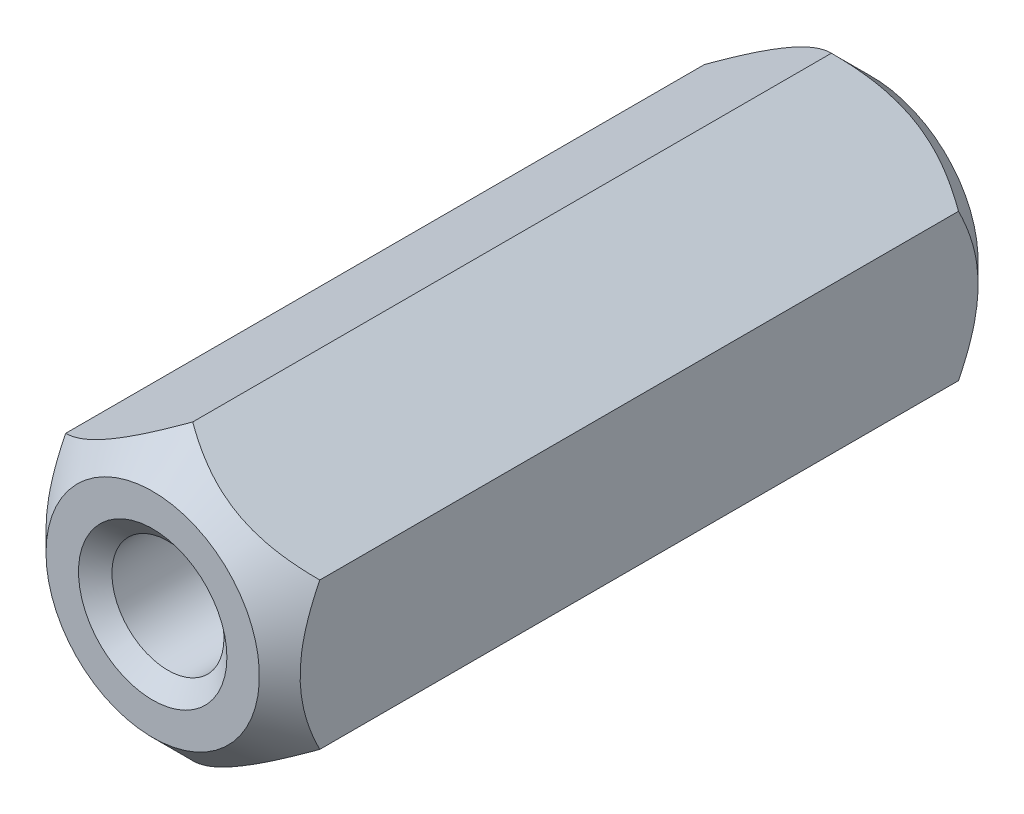
ISO-10303-21;
HEADER;
FILE_DESCRIPTION(('STEP AP214'),'2;1');
FILE_NAME('part.step','',(''),(''),'','','');
FILE_SCHEMA(('AUTOMOTIVE_DESIGN { 1 0 10303 214 1 1 1 1 }'));
ENDSEC;
DATA;
#1=APPLICATION_CONTEXT('core data for automotive mechanical design processes');
#2=APPLICATION_PROTOCOL_DEFINITION('international standard','automotive_design',2000,#1);
#3=PRODUCT_CONTEXT('',#1,'mechanical');
#4=PRODUCT('Part','Part','',(#3));
#5=PRODUCT_RELATED_PRODUCT_CATEGORY('part','',(#4));
#6=PRODUCT_DEFINITION_FORMATION('','',#4);
#7=PRODUCT_DEFINITION_CONTEXT('part definition',#1,'design');
#8=PRODUCT_DEFINITION('design','',#6,#7);
#9=PRODUCT_DEFINITION_SHAPE('','',#8);
#10=(LENGTH_UNIT() NAMED_UNIT(*) SI_UNIT(.MILLI.,.METRE.));
#11=(NAMED_UNIT(*) PLANE_ANGLE_UNIT() SI_UNIT($,.RADIAN.));
#12=(NAMED_UNIT(*) SI_UNIT($,.STERADIAN.) SOLID_ANGLE_UNIT());
#13=UNCERTAINTY_MEASURE_WITH_UNIT(LENGTH_MEASURE(1.E-05),#10,'distance_accuracy_value','');
#14=(GEOMETRIC_REPRESENTATION_CONTEXT(3) GLOBAL_UNCERTAINTY_ASSIGNED_CONTEXT((#13)) GLOBAL_UNIT_ASSIGNED_CONTEXT((#10,
#11,#12)) REPRESENTATION_CONTEXT('',''));
#15=CARTESIAN_POINT('',(0.,0.,0.));
#16=DIRECTION('',(0.,0.,1.));
#17=DIRECTION('',(1.,0.,0.));
#18=AXIS2_PLACEMENT_3D('',#15,#16,#17);
#19=CARTESIAN_POINT('',(0.,-3.66617420935412,-8.98));
#20=DIRECTION('',(0.5,-0.866025403784439,0.));
#21=DIRECTION('',(0.866025403784439,0.5,0.));
#22=AXIS2_PLACEMENT_3D('',#19,#20,#21);
#23=PLANE('',#22);
#24=CARTESIAN_POINT('',(3.1752,-1.83297163462322,-7.97988452449106));
#25=CARTESIAN_POINT('',(3.06606165005017,-1.89598269034567,-8.04284101630822));
#26=CARTESIAN_POINT('',(2.95509837192205,-1.9600473688431,-8.10209989576525));
#27=CARTESIAN_POINT('',(2.72883215365405,-2.09068223086865,-8.21060134426944));
#28=CARTESIAN_POINT('',(2.61350769674773,-2.15726483710766,-8.25978354606129));
#29=CARTESIAN_POINT('',(2.38096147751937,-2.29152545937819,-8.344033541126));
#30=CARTESIAN_POINT('',(2.26379893371884,-2.35916928558036,-8.37931308550055));
#31=CARTESIAN_POINT('',(2.02689455535371,-2.49594609220167,-8.43366842986518));
#32=CARTESIAN_POINT('',(1.90715995735644,-2.56507489458671,-8.45278480247036));
#33=CARTESIAN_POINT('',(1.70080208124841,-2.68421566990708,-8.47003286937675));
#34=CARTESIAN_POINT('',(1.61444529227084,-2.73407378526963,-8.47258606638617));
#35=CARTESIAN_POINT('',(1.44187218347527,-2.83370891608764,-8.46828372687673));
#36=CARTESIAN_POINT('',(1.35565592350718,-2.88348589698874,-8.46142489197855));
#37=CARTESIAN_POINT('',(1.18404020841286,-2.98256827629562,-8.43869011669629));
#38=CARTESIAN_POINT('',(1.09864177574671,-3.03187308438379,-8.42280409031272));
#39=CARTESIAN_POINT('',(0.92931159669451,-3.12963590884151,-8.38288201600204));
#40=CARTESIAN_POINT('',(0.845379738380235,-3.17809398983284,-8.35884659291482));
#41=CARTESIAN_POINT('',(0.696376420715868,-3.26412109539651,-8.30939476558283));
#42=CARTESIAN_POINT('',(0.630975148808253,-3.30188053733772,-8.28527828069901));
#43=CARTESIAN_POINT('',(0.501346749794881,-3.37672152840271,-8.23315853286284));
#44=CARTESIAN_POINT('',(0.437119658558265,-3.41380305681743,-8.20515515139647));
#45=CARTESIAN_POINT('',(0.310041965487392,-3.4871713971199,-8.14588943445549));
#46=CARTESIAN_POINT('',(0.247187749251269,-3.52346029578353,-8.11463734664579));
#47=CARTESIAN_POINT('',(0.122643379151903,-3.59536602138645,-8.04928465560807));
#48=CARTESIAN_POINT('',(0.0609525390212874,-3.63098324454239,-8.01518580048145));
#49=CARTESIAN_POINT('',(-0.000200000000001342,-3.66628967940796,-7.97988452449106));
#50=B_SPLINE_CURVE_WITH_KNOTS('',3,(#24,#25,#26,#27,#28,#29,#30,#31,#32,#33,#34,#35,#36,#37,#38,
#39,#40,#41,#42,#43,#44,#45,#46,#47,#48,#49),.UNSPECIFIED.,.F.,.F.,(4,2,2,2,2,2,2,2,2,2,2,2,4),
(0.,0.422910572436811,0.848285055427812,1.26690402276128,1.68446903107507,1.98329272958353,
2.28222117546892,2.58148426995467,2.88072442418454,3.11844134429547,3.35616551414406,
3.59316134346767,3.8300126974443),.UNSPECIFIED.);
#51=CARTESIAN_POINT('',(3.175,-1.83308710467706,-7.98));
#52=VERTEX_POINT('',#51);
#53=CARTESIAN_POINT('',(0.,-3.66617420935412,-7.98));
#54=VERTEX_POINT('',#53);
#55=EDGE_CURVE('E214',#52,#54,#50,.T.);
#56=ORIENTED_EDGE('',*,*,#55,.F.);
#57=DIRECTION('',(0.,0.,1.));
#58=VECTOR('',#57,1.);
#59=CARTESIAN_POINT('',(3.175,-1.83308710467706,-8.98));
#60=LINE('',#59,#58);
#61=CARTESIAN_POINT('',(3.175,-1.83308710467706,7.98));
#62=VERTEX_POINT('',#61);
#63=EDGE_CURVE('E43',#52,#62,#60,.T.);
#64=ORIENTED_EDGE('',*,*,#63,.T.);
#65=CARTESIAN_POINT('',(-0.000200000000000843,-3.66628967940796,7.97988452449106));
#66=CARTESIAN_POINT('',(0.108938349949826,-3.60327862368552,8.04284101630822));
#67=CARTESIAN_POINT('',(0.219901628077945,-3.53921394518808,8.10209989576525));
#68=CARTESIAN_POINT('',(0.446167846345948,-3.40857908316254,8.21060134426944));
#69=CARTESIAN_POINT('',(0.561492303252264,-3.34199647692353,8.25978354606129));
#70=CARTESIAN_POINT('',(0.794038522480628,-3.207735854653,8.344033541126));
#71=CARTESIAN_POINT('',(0.911201066281153,-3.14009202845083,8.37931308550055));
#72=CARTESIAN_POINT('',(1.14810544464628,-3.00331522182952,8.43366842986518));
#73=CARTESIAN_POINT('',(1.26784004264356,-2.93418641944448,8.45278480247036));
#74=CARTESIAN_POINT('',(1.47419791875159,-2.81504564412411,8.47003286937675));
#75=CARTESIAN_POINT('',(1.56055470772916,-2.76518752876156,8.47258606638617));
#76=CARTESIAN_POINT('',(1.73312781652472,-2.66555239794355,8.46828372687673));
#77=CARTESIAN_POINT('',(1.81934407649281,-2.61577541704245,8.46142489197855));
#78=CARTESIAN_POINT('',(1.99095979158714,-2.51669303773557,8.43869011669629));
#79=CARTESIAN_POINT('',(2.07635822425329,-2.4673882296474,8.42280409031272));
#80=CARTESIAN_POINT('',(2.24568840330549,-2.36962540518968,8.38288201600204));
#81=CARTESIAN_POINT('',(2.32962026161976,-2.32116732419835,8.35884659291482));
#82=CARTESIAN_POINT('',(2.47862357928413,-2.23514021863468,8.30939476558283));
#83=CARTESIAN_POINT('',(2.54402485119174,-2.19738077669347,8.285278280699));
#84=CARTESIAN_POINT('',(2.67365325020512,-2.12253978562848,8.23315853286284));
#85=CARTESIAN_POINT('',(2.73788034144173,-2.08545825721376,8.20515515139647));
#86=CARTESIAN_POINT('',(2.86495803451261,-2.01208991691129,8.14588943445549));
#87=CARTESIAN_POINT('',(2.92781225074873,-1.97580101824766,8.11463734664579));
#88=CARTESIAN_POINT('',(3.0523566208481,-1.90389529264474,8.04928465560806));
#89=CARTESIAN_POINT('',(3.11404746097871,-1.8682780694888,8.01518580048145));
#90=CARTESIAN_POINT('',(3.1752,-1.83297163462323,7.97988452449106));
#91=B_SPLINE_CURVE_WITH_KNOTS('',3,(#65,#66,#67,#68,#69,#70,#71,#72,#73,#74,#75,#76,#77,#78,#79,
#80,#81,#82,#83,#84,#85,#86,#87,#88,#89,#90),.UNSPECIFIED.,.F.,.F.,(4,2,2,2,2,2,2,2,2,2,2,2,4),
(0.,0.42291057243681,0.848285055427811,1.26690402276128,1.68446903107507,1.98329272958352,
2.28222117546891,2.58148426995467,2.88072442418453,3.11844134429547,3.35616551414406,
3.59316134346767,3.83001269744429),.UNSPECIFIED.);
#92=CARTESIAN_POINT('',(0.,-3.66617420935412,7.98));
#93=VERTEX_POINT('',#92);
#94=EDGE_CURVE('E131',#93,#62,#91,.T.);
#95=ORIENTED_EDGE('',*,*,#94,.F.);
#96=DIRECTION('',(0.,0.,1.));
#97=VECTOR('',#96,1.);
#98=CARTESIAN_POINT('',(0.,-3.66617420935412,-8.98));
#99=LINE('',#98,#97);
#100=EDGE_CURVE('E11',#54,#93,#99,.T.);
#101=ORIENTED_EDGE('',*,*,#100,.F.);
#102=EDGE_LOOP('',(#56,#64,#95,#101));
#103=FACE_BOUND('',#102,.T.);
#104=ADVANCED_FACE('F39',(#103),#23,.T.);
#105=CARTESIAN_POINT('',(-3.175,-1.83308710467706,-8.98));
#106=DIRECTION('',(-0.5,-0.866025403784438,0.));
#107=DIRECTION('',(0.866025403784439,-0.5,0.));
#108=AXIS2_PLACEMENT_3D('',#105,#106,#107);
#109=PLANE('',#108);
#110=CARTESIAN_POINT('',(0.000199999999999404,-3.66628967940796,-7.97988452449106));
#111=CARTESIAN_POINT('',(-0.108938349949828,-3.60327862368552,-8.04284101630822));
#112=CARTESIAN_POINT('',(-0.219901628077947,-3.53921394518808,-8.10209989576525));
#113=CARTESIAN_POINT('',(-0.44616784634595,-3.40857908316253,-8.21060134426944));
#114=CARTESIAN_POINT('',(-0.561492303252266,-3.34199647692352,-8.25978354606129));
#115=CARTESIAN_POINT('',(-0.79403852248063,-3.207735854653,-8.344033541126));
#116=CARTESIAN_POINT('',(-0.911201066281154,-3.14009202845082,-8.37931308550055));
#117=CARTESIAN_POINT('',(-1.14810544464629,-3.00331522182951,-8.43366842986518));
#118=CARTESIAN_POINT('',(-1.26784004264356,-2.93418641944448,-8.45278480247036));
#119=CARTESIAN_POINT('',(-1.47419791875159,-2.81504564412411,-8.47003286937675));
#120=CARTESIAN_POINT('',(-1.56055470772916,-2.76518752876155,-8.47258606638618));
#121=CARTESIAN_POINT('',(-1.73312781652473,-2.66555239794354,-8.46828372687673));
#122=CARTESIAN_POINT('',(-1.81934407649281,-2.61577541704245,-8.46142489197855));
#123=CARTESIAN_POINT('',(-1.99095979158714,-2.51669303773557,-8.43869011669629));
#124=CARTESIAN_POINT('',(-2.07635822425329,-2.46738822964739,-8.42280409031272));
#125=CARTESIAN_POINT('',(-2.24568840330549,-2.36962540518968,-8.38288201600204));
#126=CARTESIAN_POINT('',(-2.32962026161976,-2.32116732419835,-8.35884659291482));
#127=CARTESIAN_POINT('',(-2.47862357928413,-2.23514021863468,-8.30939476558283));
#128=CARTESIAN_POINT('',(-2.54402485119175,-2.19738077669347,-8.28527828069901));
#129=CARTESIAN_POINT('',(-2.67365325020512,-2.12253978562848,-8.23315853286284));
#130=CARTESIAN_POINT('',(-2.73788034144173,-2.08545825721375,-8.20515515139647));
#131=CARTESIAN_POINT('',(-2.86495803451261,-2.01208991691129,-8.14588943445549));
#132=CARTESIAN_POINT('',(-2.92781225074873,-1.97580101824766,-8.11463734664579));
#133=CARTESIAN_POINT('',(-3.0523566208481,-1.90389529264474,-8.04928465560807));
#134=CARTESIAN_POINT('',(-3.11404746097871,-1.86827806948879,-8.01518580048146));
#135=CARTESIAN_POINT('',(-3.1752,-1.83297163462322,-7.97988452449106));
#136=B_SPLINE_CURVE_WITH_KNOTS('',3,(#110,#111,#112,#113,#114,#115,#116,#117,#118,#119,#120,
#121,#122,#123,#124,#125,#126,#127,#128,#129,#130,#131,#132,#133,#134,#135),.UNSPECIFIED.,.F.,
.F.,(4,2,2,2,2,2,2,2,2,2,2,2,4),(0.,0.42291057243681,0.848285055427811,1.26690402276128,
1.68446903107507,1.98329272958353,2.28222117546891,2.58148426995467,2.88072442418453,
3.11844134429547,3.35616551414406,3.59316134346767,3.83001269744429),.UNSPECIFIED.);
#137=CARTESIAN_POINT('',(-3.175,-1.83308710467706,-7.98));
#138=VERTEX_POINT('',#137);
#139=EDGE_CURVE('E99',#54,#138,#136,.T.);
#140=ORIENTED_EDGE('',*,*,#139,.F.);
#141=ORIENTED_EDGE('',*,*,#100,.T.);
#142=CARTESIAN_POINT('',(-3.1752,-1.83297163462322,7.97988452449106));
#143=CARTESIAN_POINT('',(-3.06606165005017,-1.89598269034567,8.04284101630822));
#144=CARTESIAN_POINT('',(-2.95509837192205,-1.9600473688431,8.10209989576526));
#145=CARTESIAN_POINT('',(-2.72883215365405,-2.09068223086865,8.21060134426944));
#146=CARTESIAN_POINT('',(-2.61350769674774,-2.15726483710766,8.25978354606129));
#147=CARTESIAN_POINT('',(-2.38096147751937,-2.29152545937818,8.344033541126));
#148=CARTESIAN_POINT('',(-2.26379893371885,-2.35916928558036,8.37931308550055));
#149=CARTESIAN_POINT('',(-2.02689455535372,-2.49594609220167,8.43366842986518));
#150=CARTESIAN_POINT('',(-1.90715995735644,-2.56507489458671,8.45278480247036));
#151=CARTESIAN_POINT('',(-1.70080208124842,-2.68421566990707,8.47003286937675));
#152=CARTESIAN_POINT('',(-1.61444529227084,-2.73407378526963,8.47258606638618));
#153=CARTESIAN_POINT('',(-1.44187218347528,-2.83370891608764,8.46828372687673));
#154=CARTESIAN_POINT('',(-1.35565592350719,-2.88348589698874,8.46142489197855));
#155=CARTESIAN_POINT('',(-1.18404020841286,-2.98256827629562,8.43869011669629));
#156=CARTESIAN_POINT('',(-1.09864177574672,-3.03187308438379,8.42280409031272));
#157=CARTESIAN_POINT('',(-0.929311596694514,-3.1296359088415,8.38288201600204));
#158=CARTESIAN_POINT('',(-0.845379738380239,-3.17809398983284,8.35884659291482));
#159=CARTESIAN_POINT('',(-0.696376420715872,-3.26412109539651,8.30939476558283));
#160=CARTESIAN_POINT('',(-0.630975148808256,-3.30188053733771,8.28527828069901));
#161=CARTESIAN_POINT('',(-0.501346749794884,-3.3767215284027,8.23315853286284));
#162=CARTESIAN_POINT('',(-0.437119658558269,-3.41380305681743,8.20515515139647));
#163=CARTESIAN_POINT('',(-0.310041965487394,-3.4871713971199,8.14588943445549));
#164=CARTESIAN_POINT('',(-0.247187749251271,-3.52346029578352,8.11463734664579));
#165=CARTESIAN_POINT('',(-0.122643379151904,-3.59536602138645,8.04928465560807));
#166=CARTESIAN_POINT('',(-0.0609525390212889,-3.63098324454239,8.01518580048146));
#167=CARTESIAN_POINT('',(0.000199999999999563,-3.66628967940796,7.97988452449106));
#168=B_SPLINE_CURVE_WITH_KNOTS('',3,(#142,#143,#144,#145,#146,#147,#148,#149,#150,#151,#152,
#153,#154,#155,#156,#157,#158,#159,#160,#161,#162,#163,#164,#165,#166,#167),.UNSPECIFIED.,.F.,
.F.,(4,2,2,2,2,2,2,2,2,2,2,2,4),(0.,0.422910572436809,0.84828505542781,1.26690402276127,
1.68446903107507,1.98329272958352,2.28222117546891,2.58148426995467,2.88072442418453,
3.11844134429547,3.35616551414406,3.59316134346767,3.8300126974443),.UNSPECIFIED.);
#169=CARTESIAN_POINT('',(-3.175,-1.83308710467706,7.98));
#170=VERTEX_POINT('',#169);
#171=EDGE_CURVE('E133',#170,#93,#168,.T.);
#172=ORIENTED_EDGE('',*,*,#171,.F.);
#173=DIRECTION('',(0.,0.,1.));
#174=VECTOR('',#173,1.);
#175=CARTESIAN_POINT('',(-3.175,-1.83308710467706,-8.98));
#176=LINE('',#175,#174);
#177=EDGE_CURVE('E49',#138,#170,#176,.T.);
#178=ORIENTED_EDGE('',*,*,#177,.F.);
#179=EDGE_LOOP('',(#140,#141,#172,#178));
#180=FACE_BOUND('',#179,.T.);
#181=ADVANCED_FACE('F194',(#180),#109,.T.);
#182=CARTESIAN_POINT('',(-3.175,1.83308710467706,-8.98));
#183=DIRECTION('',(-1.,0.,0.));
#184=DIRECTION('',(0.,-1.,0.));
#185=AXIS2_PLACEMENT_3D('',#182,#183,#184);
#186=PLANE('',#185);
#187=CARTESIAN_POINT('',(-3.175,-3.62314366162436,-6.82872727215091));
#188=CARTESIAN_POINT('',(-3.175,-3.53477477471413,-6.89517330066197));
#189=CARTESIAN_POINT('',(-3.175,-3.44590747401783,-6.96096732929089));
#190=CARTESIAN_POINT('',(-3.175,-3.26698086109357,-7.09096065674581));
#191=CARTESIAN_POINT('',(-3.175,-3.17692125186334,-7.15515954631578));
#192=CARTESIAN_POINT('',(-3.175,-2.9947562299698,-7.28212801376402));
#193=CARTESIAN_POINT('',(-3.175,-2.90264037042889,-7.34488265440275));
#194=CARTESIAN_POINT('',(-3.175,-2.71683951537136,-7.4680168325571));
#195=CARTESIAN_POINT('',(-3.175,-2.62315463201829,-7.52839653882317));
#196=CARTESIAN_POINT('',(-3.175,-2.42867521304995,-7.64955311497214));
#197=CARTESIAN_POINT('',(-3.175,-2.327776197965,-7.71016312895682));
#198=CARTESIAN_POINT('',(-3.175,-2.1236266416231,-7.82734891241029));
#199=CARTESIAN_POINT('',(-3.175,-2.02037573570296,-7.88392405057173));
#200=CARTESIAN_POINT('',(-3.175,-1.81153946353305,-7.99181638181168));
#201=CARTESIAN_POINT('',(-3.175,-1.70596214797143,-8.04314903574252));
#202=CARTESIAN_POINT('',(-3.175,-1.49194968831593,-8.13940753599678));
#203=CARTESIAN_POINT('',(-3.175,-1.38351585328126,-8.18433625855787));
#204=CARTESIAN_POINT('',(-3.175,-1.17206906194383,-8.26305402653428));
#205=CARTESIAN_POINT('',(-3.175,-1.06927808219159,-8.2974331189904));
#206=CARTESIAN_POINT('',(-3.175,-0.861249989752693,-8.35794018821903));
#207=CARTESIAN_POINT('',(-3.175,-0.756012706347597,-8.38406758726936));
#208=CARTESIAN_POINT('',(-3.175,-0.545455116385145,-8.42628154980003));
#209=CARTESIAN_POINT('',(-3.175,-0.440169465308187,-8.44253816718228));
#210=CARTESIAN_POINT('',(-3.175,-0.228508692793317,-8.46470019179704));
#211=CARTESIAN_POINT('',(-3.175,-0.122133754622792,-8.47060731241113));
#212=CARTESIAN_POINT('',(-3.175,0.0869577968377128,-8.47164473816365));
#213=CARTESIAN_POINT('',(-3.175,0.189672720284836,-8.46714340706931));
#214=CARTESIAN_POINT('',(-3.175,0.394206632826208,-8.44841780352249));
#215=CARTESIAN_POINT('',(-3.175,0.496025532914313,-8.43419257595037));
#216=CARTESIAN_POINT('',(-3.175,0.699751411908734,-8.39654774602645));
#217=CARTESIAN_POINT('',(-3.175,0.801629229158968,-8.3729728022883));
#218=CARTESIAN_POINT('',(-3.175,1.00316901022372,-8.31787603830061));
#219=CARTESIAN_POINT('',(-3.175,1.10283116972946,-8.28635492293116));
#220=CARTESIAN_POINT('',(-3.175,1.30972972723242,-8.21313974500301));
#221=CARTESIAN_POINT('',(-3.175,1.41671377003006,-8.17073954984725));
#222=CARTESIAN_POINT('',(-3.175,1.62788222750015,-8.07944550923611));
#223=CARTESIAN_POINT('',(-3.175,1.73206568079256,-8.03054946728032));
#224=CARTESIAN_POINT('',(-3.175,1.93816752656033,-7.9274201972936));
#225=CARTESIAN_POINT('',(-3.175,2.04007726416977,-7.87316981162605));
#226=CARTESIAN_POINT('',(-3.175,2.24154914453307,-7.76053481703511));
#227=CARTESIAN_POINT('',(-3.175,2.34111165997837,-7.70215087041164));
#228=CARTESIAN_POINT('',(-3.175,2.53328789139578,-7.58505822864378));
#229=CARTESIAN_POINT('',(-3.175,2.62600050272272,-7.52651098750221));
#230=CARTESIAN_POINT('',(-3.175,2.80983442239984,-7.40696182904578));
#231=CARTESIAN_POINT('',(-3.175,2.90095560921207,-7.34595972541708));
#232=CARTESIAN_POINT('',(-3.175,3.08107470813498,-7.22244540123562));
#233=CARTESIAN_POINT('',(-3.175,3.17008386871529,-7.15994952545103));
#234=CARTESIAN_POINT('',(-3.175,3.34688695470737,-7.03331054967444));
#235=CARTESIAN_POINT('',(-3.175,3.43468120733686,-6.96916790704841));
#236=CARTESIAN_POINT('',(-3.175,3.52196693533842,-6.90435218679603));
#237=B_SPLINE_CURVE_WITH_KNOTS('',3,(#187,#188,#189,#190,#191,#192,#193,#194,#195,#196,#197,
#198,#199,#200,#201,#202,#203,#204,#205,#206,#207,#208,#209,#210,#211,#212,#213,#214,#215,#216,
#217,#218,#219,#220,#221,#222,#223,#224,#225,#226,#227,#228,#229,#230,#231,#232,#233,#234,#235,
#236),.UNSPECIFIED.,.F.,.F.,(4,2,2,2,2,2,2,2,2,2,2,2,2,2,2,2,2,2,2,2,2,2,2,2,4),(0.,
0.331695086033259,0.663474412411203,0.99782559347852,1.33215297421855,1.68518935827853,
2.03828085871132,2.39029899374214,2.74215852308448,3.06703502033416,3.39193425797894,
3.71106436530982,4.03014163496714,4.33810010599997,4.64608883028138,4.95942473763719,
5.27273285971666,5.61770254927929,5.96278918493365,6.30901993384334,6.65519533292016,
6.9841037594293,7.3130371959719,7.63929174244194,7.96545663622252),.UNSPECIFIED.);
#238=CARTESIAN_POINT('',(-3.175,1.83308710467706,-7.98));
#239=VERTEX_POINT('',#238);
#240=EDGE_CURVE('E93',#138,#239,#237,.T.);
#241=ORIENTED_EDGE('',*,*,#240,.F.);
#242=ORIENTED_EDGE('',*,*,#177,.T.);
#243=CARTESIAN_POINT('',(-3.175,-3.62314366162436,6.82872727215091));
#244=CARTESIAN_POINT('',(-3.175,-3.53477477471413,6.89517330066197));
#245=CARTESIAN_POINT('',(-3.175,-3.44590747401783,6.96096732929089));
#246=CARTESIAN_POINT('',(-3.175,-3.26698086109357,7.09096065674581));
#247=CARTESIAN_POINT('',(-3.175,-3.17692125186334,7.15515954631578));
#248=CARTESIAN_POINT('',(-3.175,-2.9947562299698,7.28212801376402));
#249=CARTESIAN_POINT('',(-3.175,-2.90264037042889,7.34488265440275));
#250=CARTESIAN_POINT('',(-3.175,-2.71683951537136,7.4680168325571));
#251=CARTESIAN_POINT('',(-3.175,-2.62315463201829,7.52839653882317));
#252=CARTESIAN_POINT('',(-3.175,-2.42867521304995,7.64955311497214));
#253=CARTESIAN_POINT('',(-3.175,-2.327776197965,7.71016312895682));
#254=CARTESIAN_POINT('',(-3.175,-2.1236266416231,7.82734891241029));
#255=CARTESIAN_POINT('',(-3.175,-2.02037573570296,7.88392405057173));
#256=CARTESIAN_POINT('',(-3.175,-1.81153946353305,7.99181638181168));
#257=CARTESIAN_POINT('',(-3.175,-1.70596214797143,8.04314903574252));
#258=CARTESIAN_POINT('',(-3.175,-1.49194968831593,8.13940753599678));
#259=CARTESIAN_POINT('',(-3.175,-1.38351585328126,8.18433625855787));
#260=CARTESIAN_POINT('',(-3.175,-1.17206906194383,8.26305402653428));
#261=CARTESIAN_POINT('',(-3.175,-1.06927808219159,8.2974331189904));
#262=CARTESIAN_POINT('',(-3.175,-0.861249989752693,8.35794018821903));
#263=CARTESIAN_POINT('',(-3.175,-0.756012706347597,8.38406758726936));
#264=CARTESIAN_POINT('',(-3.175,-0.545455116385145,8.42628154980003));
#265=CARTESIAN_POINT('',(-3.175,-0.440169465308187,8.44253816718228));
#266=CARTESIAN_POINT('',(-3.175,-0.228508692793317,8.46470019179704));
#267=CARTESIAN_POINT('',(-3.175,-0.122133754622792,8.47060731241113));
#268=CARTESIAN_POINT('',(-3.175,0.0869577968377128,8.47164473816365));
#269=CARTESIAN_POINT('',(-3.175,0.189672720284836,8.46714340706931));
#270=CARTESIAN_POINT('',(-3.175,0.394206632826208,8.44841780352249));
#271=CARTESIAN_POINT('',(-3.175,0.496025532914313,8.43419257595037));
#272=CARTESIAN_POINT('',(-3.175,0.699751411908734,8.39654774602645));
#273=CARTESIAN_POINT('',(-3.175,0.801629229158968,8.3729728022883));
#274=CARTESIAN_POINT('',(-3.175,1.00316901022372,8.31787603830061));
#275=CARTESIAN_POINT('',(-3.175,1.10283116972946,8.28635492293116));
#276=CARTESIAN_POINT('',(-3.175,1.30972972723242,8.21313974500301));
#277=CARTESIAN_POINT('',(-3.175,1.41671377003006,8.17073954984725));
#278=CARTESIAN_POINT('',(-3.175,1.62788222750015,8.07944550923611));
#279=CARTESIAN_POINT('',(-3.175,1.73206568079256,8.03054946728032));
#280=CARTESIAN_POINT('',(-3.175,1.93816752656033,7.9274201972936));
#281=CARTESIAN_POINT('',(-3.175,2.04007726416977,7.87316981162605));
#282=CARTESIAN_POINT('',(-3.175,2.24154914453307,7.76053481703511));
#283=CARTESIAN_POINT('',(-3.175,2.34111165997837,7.70215087041164));
#284=CARTESIAN_POINT('',(-3.175,2.53328789139578,7.58505822864378));
#285=CARTESIAN_POINT('',(-3.175,2.62600050272272,7.52651098750221));
#286=CARTESIAN_POINT('',(-3.175,2.80983442239984,7.40696182904578));
#287=CARTESIAN_POINT('',(-3.175,2.90095560921207,7.34595972541708));
#288=CARTESIAN_POINT('',(-3.175,3.08107470813498,7.22244540123562));
#289=CARTESIAN_POINT('',(-3.175,3.17008386871529,7.15994952545103));
#290=CARTESIAN_POINT('',(-3.175,3.34688695470737,7.03331054967444));
#291=CARTESIAN_POINT('',(-3.175,3.43468120733686,6.96916790704841));
#292=CARTESIAN_POINT('',(-3.175,3.52196693533842,6.90435218679603));
#293=B_SPLINE_CURVE_WITH_KNOTS('',3,(#243,#244,#245,#246,#247,#248,#249,#250,#251,#252,#253,
#254,#255,#256,#257,#258,#259,#260,#261,#262,#263,#264,#265,#266,#267,#268,#269,#270,#271,#272,
#273,#274,#275,#276,#277,#278,#279,#280,#281,#282,#283,#284,#285,#286,#287,#288,#289,#290,#291,
#292),.UNSPECIFIED.,.F.,.F.,(4,2,2,2,2,2,2,2,2,2,2,2,2,2,2,2,2,2,2,2,2,2,2,2,4),(0.,
0.331695086033259,0.663474412411203,0.99782559347852,1.33215297421855,1.68518935827853,
2.03828085871132,2.39029899374214,2.74215852308448,3.06703502033416,3.39193425797894,
3.71106436530982,4.03014163496714,4.33810010599997,4.64608883028138,4.95942473763719,
5.27273285971666,5.61770254927929,5.96278918493365,6.30901993384334,6.65519533292016,
6.9841037594293,7.3130371959719,7.63929174244194,7.96545663622252),.UNSPECIFIED.);
#294=CARTESIAN_POINT('',(-3.175,1.83308710467706,7.98));
#295=VERTEX_POINT('',#294);
#296=EDGE_CURVE('E117',#295,#170,#293,.F.);
#297=ORIENTED_EDGE('',*,*,#296,.F.);
#298=DIRECTION('',(0.,0.,1.));
#299=VECTOR('',#298,1.);
#300=CARTESIAN_POINT('',(-3.175,1.83308710467706,-8.98));
#301=LINE('',#300,#299);
#302=EDGE_CURVE('E109',#239,#295,#301,.T.);
#303=ORIENTED_EDGE('',*,*,#302,.F.);
#304=EDGE_LOOP('',(#241,#242,#297,#303));
#305=FACE_BOUND('',#304,.T.);
#306=ADVANCED_FACE('F115',(#305),#186,.T.);
#307=CARTESIAN_POINT('',(0.,3.66617420935412,-8.98));
#308=DIRECTION('',(-0.5,0.866025403784439,0.));
#309=DIRECTION('',(-0.866025403784439,-0.5,0.));
#310=AXIS2_PLACEMENT_3D('',#307,#308,#309);
#311=PLANE('',#310);
#312=CARTESIAN_POINT('',(-3.1752,1.83297163462323,-7.97988452449106));
#313=CARTESIAN_POINT('',(-3.06606165005017,1.89598269034567,-8.04284101630822));
#314=CARTESIAN_POINT('',(-2.95509837192205,1.9600473688431,-8.10209989576525));
#315=CARTESIAN_POINT('',(-2.72883215365405,2.09068223086865,-8.21060134426944));
#316=CARTESIAN_POINT('',(-2.61350769674773,2.15726483710766,-8.25978354606129));
#317=CARTESIAN_POINT('',(-2.38096147751937,2.29152545937819,-8.344033541126));
#318=CARTESIAN_POINT('',(-2.26379893371885,2.35916928558036,-8.37931308550055));
#319=CARTESIAN_POINT('',(-2.02689455535371,2.49594609220167,-8.43366842986518));
#320=CARTESIAN_POINT('',(-1.90715995735644,2.56507489458671,-8.45278480247036));
#321=CARTESIAN_POINT('',(-1.70080208124841,2.68421566990708,-8.47003286937675));
#322=CARTESIAN_POINT('',(-1.61444529227084,2.73407378526963,-8.47258606638618));
#323=CARTESIAN_POINT('',(-1.44187218347527,2.83370891608764,-8.46828372687673));
#324=CARTESIAN_POINT('',(-1.35565592350719,2.88348589698874,-8.46142489197855));
#325=CARTESIAN_POINT('',(-1.18404020841286,2.98256827629562,-8.43869011669629));
#326=CARTESIAN_POINT('',(-1.09864177574671,3.03187308438379,-8.42280409031272));
#327=CARTESIAN_POINT('',(-0.929311596694511,3.12963590884151,-8.38288201600204));
#328=CARTESIAN_POINT('',(-0.845379738380236,3.17809398983284,-8.35884659291482));
#329=CARTESIAN_POINT('',(-0.696376420715869,3.26412109539651,-8.30939476558283));
#330=CARTESIAN_POINT('',(-0.630975148808253,3.30188053733771,-8.28527828069901));
#331=CARTESIAN_POINT('',(-0.501346749794881,3.37672152840271,-8.23315853286284));
#332=CARTESIAN_POINT('',(-0.437119658558266,3.41380305681743,-8.20515515139647));
#333=CARTESIAN_POINT('',(-0.310041965487392,3.4871713971199,-8.14588943445549));
#334=CARTESIAN_POINT('',(-0.247187749251269,3.52346029578353,-8.11463734664579));
#335=CARTESIAN_POINT('',(-0.122643379151903,3.59536602138645,-8.04928465560806));
#336=CARTESIAN_POINT('',(-0.0609525390212874,3.63098324454239,-8.01518580048145));
#337=CARTESIAN_POINT('',(0.000200000000001656,3.66628967940796,-7.97988452449106));
#338=B_SPLINE_CURVE_WITH_KNOTS('',3,(#312,#313,#314,#315,#316,#317,#318,#319,#320,#321,#322,
#323,#324,#325,#326,#327,#328,#329,#330,#331,#332,#333,#334,#335,#336,#337),.UNSPECIFIED.,.F.,
.F.,(4,2,2,2,2,2,2,2,2,2,2,2,4),(0.,0.42291057243681,0.84828505542781,1.26690402276128,
1.68446903107507,1.98329272958352,2.28222117546891,2.58148426995467,2.88072442418453,
3.11844134429547,3.35616551414406,3.59316134346767,3.8300126974443),.UNSPECIFIED.);
#339=CARTESIAN_POINT('',(0.,3.66617420935412,-7.98));
#340=VERTEX_POINT('',#339);
#341=EDGE_CURVE('E97',#239,#340,#338,.T.);
#342=ORIENTED_EDGE('',*,*,#341,.F.);
#343=ORIENTED_EDGE('',*,*,#302,.T.);
#344=CARTESIAN_POINT('',(0.000200000000001738,3.66628967940796,7.97988452449106));
#345=CARTESIAN_POINT('',(-0.108938349949825,3.60327862368552,8.04284101630822));
#346=CARTESIAN_POINT('',(-0.219901628077945,3.53921394518808,8.10209989576525));
#347=CARTESIAN_POINT('',(-0.446167846345948,3.40857908316253,8.21060134426944));
#348=CARTESIAN_POINT('',(-0.561492303252265,3.34199647692353,8.25978354606129));
#349=CARTESIAN_POINT('',(-0.79403852248063,3.207735854653,8.344033541126));
#350=CARTESIAN_POINT('',(-0.911201066281154,3.14009202845082,8.37931308550055));
#351=CARTESIAN_POINT('',(-1.14810544464629,3.00331522182951,8.43366842986518));
#352=CARTESIAN_POINT('',(-1.26784004264356,2.93418641944448,8.45278480247036));
#353=CARTESIAN_POINT('',(-1.47419791875159,2.81504564412411,8.47003286937675));
#354=CARTESIAN_POINT('',(-1.56055470772916,2.76518752876155,8.47258606638618));
#355=CARTESIAN_POINT('',(-1.73312781652473,2.66555239794354,8.46828372687673));
#356=CARTESIAN_POINT('',(-1.81934407649282,2.61577541704245,8.46142489197855));
#357=CARTESIAN_POINT('',(-1.99095979158714,2.51669303773557,8.43869011669629));
#358=CARTESIAN_POINT('',(-2.07635822425329,2.4673882296474,8.42280409031272));
#359=CARTESIAN_POINT('',(-2.24568840330549,2.36962540518968,8.38288201600204));
#360=CARTESIAN_POINT('',(-2.32962026161977,2.32116732419835,8.35884659291482));
#361=CARTESIAN_POINT('',(-2.47862357928413,2.23514021863468,8.30939476558283));
#362=CARTESIAN_POINT('',(-2.54402485119175,2.19738077669347,8.28527828069901));
#363=CARTESIAN_POINT('',(-2.67365325020512,2.12253978562848,8.23315853286284));
#364=CARTESIAN_POINT('',(-2.73788034144173,2.08545825721376,8.20515515139647));
#365=CARTESIAN_POINT('',(-2.86495803451261,2.01208991691129,8.14588943445548));
#366=CARTESIAN_POINT('',(-2.92781225074873,1.97580101824766,8.11463734664579));
#367=CARTESIAN_POINT('',(-3.0523566208481,1.90389529264474,8.04928465560807));
#368=CARTESIAN_POINT('',(-3.11404746097871,1.8682780694888,8.01518580048145));
#369=CARTESIAN_POINT('',(-3.1752,1.83297163462323,7.97988452449106));
#370=B_SPLINE_CURVE_WITH_KNOTS('',3,(#344,#345,#346,#347,#348,#349,#350,#351,#352,#353,#354,
#355,#356,#357,#358,#359,#360,#361,#362,#363,#364,#365,#366,#367,#368,#369),.UNSPECIFIED.,.F.,
.F.,(4,2,2,2,2,2,2,2,2,2,2,2,4),(0.,0.42291057243681,0.848285055427813,1.26690402276128,
1.68446903107507,1.98329272958353,2.28222117546892,2.58148426995467,2.88072442418454,
3.11844134429548,3.35616551414406,3.59316134346767,3.8300126974443),.UNSPECIFIED.);
#371=CARTESIAN_POINT('',(0.,3.66617420935412,7.98));
#372=VERTEX_POINT('',#371);
#373=EDGE_CURVE('E180',#372,#295,#370,.T.);
#374=ORIENTED_EDGE('',*,*,#373,.F.);
#375=DIRECTION('',(0.,0.,1.));
#376=VECTOR('',#375,1.);
#377=CARTESIAN_POINT('',(0.,3.66617420935412,-8.98));
#378=LINE('',#377,#376);
#379=EDGE_CURVE('E111',#340,#372,#378,.T.);
#380=ORIENTED_EDGE('',*,*,#379,.F.);
#381=EDGE_LOOP('',(#342,#343,#374,#380));
#382=FACE_BOUND('',#381,.T.);
#383=ADVANCED_FACE('F107',(#382),#311,.T.);
#384=CARTESIAN_POINT('',(3.175,1.83308710467706,-8.98));
#385=DIRECTION('',(0.5,0.866025403784438,0.));
#386=DIRECTION('',(-0.866025403784438,0.5,0.));
#387=AXIS2_PLACEMENT_3D('',#384,#385,#386);
#388=PLANE('',#387);
#389=CARTESIAN_POINT('',(-0.000199999999998509,3.66628967940796,-7.97988452449106));
#390=CARTESIAN_POINT('',(0.108938349949828,3.60327862368552,-8.04284101630822));
#391=CARTESIAN_POINT('',(0.219901628077947,3.53921394518808,-8.10209989576525));
#392=CARTESIAN_POINT('',(0.44616784634595,3.40857908316253,-8.21060134426944));
#393=CARTESIAN_POINT('',(0.561492303252266,3.34199647692353,-8.25978354606129));
#394=CARTESIAN_POINT('',(0.794038522480631,3.207735854653,-8.344033541126));
#395=CARTESIAN_POINT('',(0.911201066281155,3.14009202845083,-8.37931308550055));
#396=CARTESIAN_POINT('',(1.14810544464629,3.00331522182952,-8.43366842986518));
#397=CARTESIAN_POINT('',(1.26784004264356,2.93418641944448,-8.45278480247036));
#398=CARTESIAN_POINT('',(1.47419791875159,2.81504564412411,-8.47003286937675));
#399=CARTESIAN_POINT('',(1.56055470772916,2.76518752876155,-8.47258606638617));
#400=CARTESIAN_POINT('',(1.73312781652473,2.66555239794354,-8.46828372687673));
#401=CARTESIAN_POINT('',(1.81934407649282,2.61577541704245,-8.46142489197855));
#402=CARTESIAN_POINT('',(1.99095979158714,2.51669303773557,-8.43869011669629));
#403=CARTESIAN_POINT('',(2.07635822425329,2.46738822964739,-8.42280409031272));
#404=CARTESIAN_POINT('',(2.24568840330549,2.36962540518968,-8.38288201600204));
#405=CARTESIAN_POINT('',(2.32962026161977,2.32116732419835,-8.35884659291482));
#406=CARTESIAN_POINT('',(2.47862357928413,2.23514021863468,-8.30939476558283));
#407=CARTESIAN_POINT('',(2.54402485119175,2.19738077669347,-8.28527828069901));
#408=CARTESIAN_POINT('',(2.67365325020512,2.12253978562848,-8.23315853286284));
#409=CARTESIAN_POINT('',(2.73788034144173,2.08545825721375,-8.20515515139647));
#410=CARTESIAN_POINT('',(2.86495803451261,2.01208991691129,-8.14588943445549));
#411=CARTESIAN_POINT('',(2.92781225074873,1.97580101824766,-8.11463734664579));
#412=CARTESIAN_POINT('',(3.0523566208481,1.90389529264474,-8.04928465560807));
#413=CARTESIAN_POINT('',(3.11404746097871,1.86827806948879,-8.01518580048146));
#414=CARTESIAN_POINT('',(3.1752,1.83297163462322,-7.97988452449106));
#415=B_SPLINE_CURVE_WITH_KNOTS('',3,(#389,#390,#391,#392,#393,#394,#395,#396,#397,#398,#399,
#400,#401,#402,#403,#404,#405,#406,#407,#408,#409,#410,#411,#412,#413,#414),.UNSPECIFIED.,.F.,
.F.,(4,2,2,2,2,2,2,2,2,2,2,2,4),(0.,0.422910572436809,0.848285055427811,1.26690402276128,
1.68446903107507,1.98329272958353,2.28222117546892,2.58148426995467,2.88072442418454,
3.11844134429547,3.35616551414406,3.59316134346767,3.83001269744429),.UNSPECIFIED.);
#416=CARTESIAN_POINT('',(3.175,1.83308710467706,-7.98));
#417=VERTEX_POINT('',#416);
#418=EDGE_CURVE('E57',#340,#417,#415,.T.);
#419=ORIENTED_EDGE('',*,*,#418,.F.);
#420=ORIENTED_EDGE('',*,*,#379,.T.);
#421=CARTESIAN_POINT('',(3.1752,1.83297163462322,7.97988452449106));
#422=CARTESIAN_POINT('',(3.06606165005017,1.89598269034567,8.04284101630822));
#423=CARTESIAN_POINT('',(2.95509837192205,1.9600473688431,8.10209989576525));
#424=CARTESIAN_POINT('',(2.72883215365405,2.09068223086865,8.21060134426944));
#425=CARTESIAN_POINT('',(2.61350769674774,2.15726483710766,8.25978354606129));
#426=CARTESIAN_POINT('',(2.38096147751937,2.29152545937819,8.344033541126));
#427=CARTESIAN_POINT('',(2.26379893371885,2.35916928558036,8.37931308550055));
#428=CARTESIAN_POINT('',(2.02689455535372,2.49594609220167,8.43366842986518));
#429=CARTESIAN_POINT('',(1.90715995735644,2.56507489458671,8.45278480247036));
#430=CARTESIAN_POINT('',(1.70080208124842,2.68421566990708,8.47003286937675));
#431=CARTESIAN_POINT('',(1.61444529227084,2.73407378526963,8.47258606638617));
#432=CARTESIAN_POINT('',(1.44187218347528,2.83370891608764,8.46828372687673));
#433=CARTESIAN_POINT('',(1.35565592350719,2.88348589698874,8.46142489197855));
#434=CARTESIAN_POINT('',(1.18404020841286,2.98256827629562,8.43869011669629));
#435=CARTESIAN_POINT('',(1.09864177574672,3.03187308438379,8.42280409031272));
#436=CARTESIAN_POINT('',(0.929311596694514,3.12963590884151,8.38288201600204));
#437=CARTESIAN_POINT('',(0.845379738380238,3.17809398983284,8.35884659291482));
#438=CARTESIAN_POINT('',(0.696376420715871,3.26412109539651,8.30939476558283));
#439=CARTESIAN_POINT('',(0.630975148808256,3.30188053733771,8.285278280699));
#440=CARTESIAN_POINT('',(0.501346749794883,3.37672152840271,8.23315853286284));
#441=CARTESIAN_POINT('',(0.437119658558268,3.41380305681743,8.20515515139647));
#442=CARTESIAN_POINT('',(0.310041965487394,3.4871713971199,8.14588943445549));
#443=CARTESIAN_POINT('',(0.247187749251272,3.52346029578353,8.11463734664579));
#444=CARTESIAN_POINT('',(0.122643379151906,3.59536602138645,8.04928465560806));
#445=CARTESIAN_POINT('',(0.0609525390212905,3.63098324454239,8.01518580048145));
#446=CARTESIAN_POINT('',(-0.000199999999998458,3.66628967940796,7.97988452449106));
#447=B_SPLINE_CURVE_WITH_KNOTS('',3,(#421,#422,#423,#424,#425,#426,#427,#428,#429,#430,#431,
#432,#433,#434,#435,#436,#437,#438,#439,#440,#441,#442,#443,#444,#445,#446),.UNSPECIFIED.,.F.,
.F.,(4,2,2,2,2,2,2,2,2,2,2,2,4),(0.,0.422910572436808,0.848285055427809,1.26690402276127,
1.68446903107507,1.98329272958352,2.28222117546891,2.58148426995467,2.88072442418453,
3.11844134429547,3.35616551414406,3.59316134346767,3.83001269744429),.UNSPECIFIED.);
#448=CARTESIAN_POINT('',(3.175,1.83308710467706,7.98));
#449=VERTEX_POINT('',#448);
#450=EDGE_CURVE('E172',#449,#372,#447,.T.);
#451=ORIENTED_EDGE('',*,*,#450,.F.);
#452=DIRECTION('',(0.,0.,1.));
#453=VECTOR('',#452,1.);
#454=CARTESIAN_POINT('',(3.175,1.83308710467706,-8.98));
#455=LINE('',#454,#453);
#456=EDGE_CURVE('E123',#417,#449,#455,.T.);
#457=ORIENTED_EDGE('',*,*,#456,.F.);
#458=EDGE_LOOP('',(#419,#420,#451,#457));
#459=FACE_BOUND('',#458,.T.);
#460=ADVANCED_FACE('F238',(#459),#388,.T.);
#461=CARTESIAN_POINT('',(3.175,-1.83308710467706,-8.98));
#462=DIRECTION('',(1.,0.,0.));
#463=DIRECTION('',(0.,0.,-1.));
#464=AXIS2_PLACEMENT_3D('',#461,#462,#463);
#465=PLANE('',#464);
#466=CARTESIAN_POINT('',(3.175,-3.62314366067579,-6.82872727286431));
#467=CARTESIAN_POINT('',(3.175,-3.53477477379202,-6.89517330134794));
#468=CARTESIAN_POINT('',(3.175,-3.44590747312225,-6.96096732994945));
#469=CARTESIAN_POINT('',(3.175,-3.26698086025134,-7.09096065734972));
#470=CARTESIAN_POINT('',(3.175,-3.17692125104791,-7.15515954689244));
#471=CARTESIAN_POINT('',(3.175,-2.99475622920889,-7.28212801428601));
#472=CARTESIAN_POINT('',(3.175,-2.9026403696957,-7.34488265489732));
#473=CARTESIAN_POINT('',(3.175,-2.71683951469413,-7.46801683299725));
#474=CARTESIAN_POINT('',(3.175,-2.62315463136928,-7.52839653923633));
#475=CARTESIAN_POINT('',(3.175,-2.42867521246179,-7.6495531153292));
#476=CARTESIAN_POINT('',(3.175,-2.32777619740955,-7.71016312928487));
#477=CARTESIAN_POINT('',(3.175,-2.12362664113426,-7.82734891268168));
#478=CARTESIAN_POINT('',(3.175,-2.02037573524801,-7.88392405081547));
#479=CARTESIAN_POINT('',(3.175,-1.81153946314711,-7.9918163820024));
#480=CARTESIAN_POINT('',(3.175,-1.7059621476206,-8.04314903590788));
#481=CARTESIAN_POINT('',(3.175,-1.49194968803719,-8.1394075361146));
#482=CARTESIAN_POINT('',(3.175,-1.3835158530395,-8.18433625865351));
#483=CARTESIAN_POINT('',(3.175,-1.17206906171815,-8.2630540266131));
#484=CARTESIAN_POINT('',(3.175,-1.06927808194341,-8.29743311907037));
#485=CARTESIAN_POINT('',(3.175,-0.86124998945881,-8.35794018829673));
#486=CARTESIAN_POINT('',(3.175,-0.756012706030514,-8.38406758734365));
#487=CARTESIAN_POINT('',(3.175,-0.545455116022437,-8.42628154986224));
#488=CARTESIAN_POINT('',(3.175,-0.440169464923066,-8.44253816723596));
#489=CARTESIAN_POINT('',(3.175,-0.228508692364152,-8.46470019182863));
#490=CARTESIAN_POINT('',(3.175,-0.122133754171996,-8.47060731242916));
#491=CARTESIAN_POINT('',(3.175,0.0869577973290805,-8.47164473815084));
#492=CARTESIAN_POINT('',(3.175,0.1896727207952,-8.46714340703938));
#493=CARTESIAN_POINT('',(3.175,0.394206633372702,-8.44841780345565));
#494=CARTESIAN_POINT('',(3.175,0.496025533477941,-8.43419257586372));
#495=CARTESIAN_POINT('',(3.175,0.699751412506187,-8.39654774589824));
#496=CARTESIAN_POINT('',(3.175,0.801629229773064,-8.37297280213821));
#497=CARTESIAN_POINT('',(3.175,1.00316901086953,-8.31787603810625));
#498=CARTESIAN_POINT('',(3.175,1.10283117039033,-8.28635492271443));
#499=CARTESIAN_POINT('',(3.175,1.30972972797288,-8.2131397447221));
#500=CARTESIAN_POINT('',(3.175,1.41671377083364,-8.17073954952092));
#501=CARTESIAN_POINT('',(3.175,1.62788222842673,-8.07944550881442));
#502=CARTESIAN_POINT('',(3.175,1.73206568177902,-8.0305494668087));
#503=CARTESIAN_POINT('',(3.175,1.93816752766441,-7.92742019671909));
#504=CARTESIAN_POINT('',(3.175,2.04007726533157,-7.87316981099857));
#505=CARTESIAN_POINT('',(3.175,2.24154914580843,-7.76053481630007));
#506=CARTESIAN_POINT('',(3.175,2.34111166130958,-7.702150869622));
#507=CARTESIAN_POINT('',(3.175,2.53328789282852,-7.58505822775043));
#508=CARTESIAN_POINT('',(3.175,2.62600050420133,-7.52651098656001));
#509=CARTESIAN_POINT('',(3.175,2.80983442396953,-7.40696182800565));
#510=CARTESIAN_POINT('',(3.175,2.90095561082698,-7.34595972432788));
#511=CARTESIAN_POINT('',(3.175,3.08107470983924,-7.22244540004885));
#512=CARTESIAN_POINT('',(3.175,3.17008387046369,-7.15994952421576));
#513=CARTESIAN_POINT('',(3.175,3.34688695654375,-7.03331054834222));
#514=CARTESIAN_POINT('',(3.175,3.43468120921709,-6.96916790566774));
#515=CARTESIAN_POINT('',(3.175,3.52196693726243,-6.90435218536698));
#516=B_SPLINE_CURVE_WITH_KNOTS('',3,(#466,#467,#468,#469,#470,#471,#472,#473,#474,#475,#476,
#477,#478,#479,#480,#481,#482,#483,#484,#485,#486,#487,#488,#489,#490,#491,#492,#493,#494,#495,
#496,#497,#498,#499,#500,#501,#502,#503,#504,#505,#506,#507,#508,#509,#510,#511,#512,#513,#514,
#515),.UNSPECIFIED.,.F.,.F.,(4,2,2,2,2,2,2,2,2,2,2,2,2,2,2,2,2,2,2,2,2,2,2,2,4),(0.,
0.331695085920361,0.663474412185374,0.997825593137643,1.33215297376264,1.68518935769371,
2.03828085799751,2.39029899290042,2.74215852211506,3.06703501942959,3.3919342571391,
3.71106436453215,4.03014163425164,4.33810010534342,4.64608882968384,4.95942473710304,
5.27273285924588,5.61770254903443,5.96278918491495,6.3090199340521,6.65519533335629,
6.98410376006005,7.31303719679728,7.6392917434593,7.96545663743185),.UNSPECIFIED.);
#517=EDGE_CURVE('E233',#417,#52,#516,.F.);
#518=ORIENTED_EDGE('',*,*,#517,.F.);
#519=ORIENTED_EDGE('',*,*,#456,.T.);
#520=CARTESIAN_POINT('',(3.175,-3.62314366067579,6.82872727286431));
#521=CARTESIAN_POINT('',(3.175,-3.53477477379202,6.89517330134794));
#522=CARTESIAN_POINT('',(3.175,-3.44590747312225,6.96096732994945));
#523=CARTESIAN_POINT('',(3.175,-3.26698086025134,7.09096065734972));
#524=CARTESIAN_POINT('',(3.175,-3.17692125104791,7.15515954689244));
#525=CARTESIAN_POINT('',(3.175,-2.99475622920889,7.28212801428601));
#526=CARTESIAN_POINT('',(3.175,-2.9026403696957,7.34488265489732));
#527=CARTESIAN_POINT('',(3.175,-2.71683951469413,7.46801683299725));
#528=CARTESIAN_POINT('',(3.175,-2.62315463136928,7.52839653923633));
#529=CARTESIAN_POINT('',(3.175,-2.42867521246179,7.6495531153292));
#530=CARTESIAN_POINT('',(3.175,-2.32777619740955,7.71016312928487));
#531=CARTESIAN_POINT('',(3.175,-2.12362664113426,7.82734891268168));
#532=CARTESIAN_POINT('',(3.175,-2.02037573524801,7.88392405081547));
#533=CARTESIAN_POINT('',(3.175,-1.81153946314711,7.9918163820024));
#534=CARTESIAN_POINT('',(3.175,-1.7059621476206,8.04314903590788));
#535=CARTESIAN_POINT('',(3.175,-1.49194968803719,8.1394075361146));
#536=CARTESIAN_POINT('',(3.175,-1.3835158530395,8.18433625865351));
#537=CARTESIAN_POINT('',(3.175,-1.17206906171815,8.2630540266131));
#538=CARTESIAN_POINT('',(3.175,-1.06927808194341,8.29743311907037));
#539=CARTESIAN_POINT('',(3.175,-0.86124998945881,8.35794018829673));
#540=CARTESIAN_POINT('',(3.175,-0.756012706030514,8.38406758734365));
#541=CARTESIAN_POINT('',(3.175,-0.545455116022437,8.42628154986224));
#542=CARTESIAN_POINT('',(3.175,-0.440169464923066,8.44253816723596));
#543=CARTESIAN_POINT('',(3.175,-0.228508692364152,8.46470019182863));
#544=CARTESIAN_POINT('',(3.175,-0.122133754171996,8.47060731242916));
#545=CARTESIAN_POINT('',(3.175,0.0869577973290805,8.47164473815084));
#546=CARTESIAN_POINT('',(3.175,0.1896727207952,8.46714340703938));
#547=CARTESIAN_POINT('',(3.175,0.394206633372702,8.44841780345565));
#548=CARTESIAN_POINT('',(3.175,0.496025533477941,8.43419257586372));
#549=CARTESIAN_POINT('',(3.175,0.699751412506187,8.39654774589824));
#550=CARTESIAN_POINT('',(3.175,0.801629229773064,8.37297280213821));
#551=CARTESIAN_POINT('',(3.175,1.00316901086953,8.31787603810625));
#552=CARTESIAN_POINT('',(3.175,1.10283117039033,8.28635492271443));
#553=CARTESIAN_POINT('',(3.175,1.30972972797288,8.2131397447221));
#554=CARTESIAN_POINT('',(3.175,1.41671377083364,8.17073954952092));
#555=CARTESIAN_POINT('',(3.175,1.62788222842673,8.07944550881442));
#556=CARTESIAN_POINT('',(3.175,1.73206568177902,8.0305494668087));
#557=CARTESIAN_POINT('',(3.175,1.93816752766441,7.92742019671909));
#558=CARTESIAN_POINT('',(3.175,2.04007726533157,7.87316981099857));
#559=CARTESIAN_POINT('',(3.175,2.24154914580843,7.76053481630007));
#560=CARTESIAN_POINT('',(3.175,2.34111166130958,7.702150869622));
#561=CARTESIAN_POINT('',(3.175,2.53328789282852,7.58505822775043));
#562=CARTESIAN_POINT('',(3.175,2.62600050420133,7.52651098656001));
#563=CARTESIAN_POINT('',(3.175,2.80983442396953,7.40696182800565));
#564=CARTESIAN_POINT('',(3.175,2.90095561082698,7.34595972432788));
#565=CARTESIAN_POINT('',(3.175,3.08107470983924,7.22244540004885));
#566=CARTESIAN_POINT('',(3.175,3.17008387046369,7.15994952421576));
#567=CARTESIAN_POINT('',(3.175,3.34688695654375,7.03331054834222));
#568=CARTESIAN_POINT('',(3.175,3.43468120921709,6.96916790566774));
#569=CARTESIAN_POINT('',(3.175,3.52196693726243,6.90435218536698));
#570=B_SPLINE_CURVE_WITH_KNOTS('',3,(#520,#521,#522,#523,#524,#525,#526,#527,#528,#529,#530,
#531,#532,#533,#534,#535,#536,#537,#538,#539,#540,#541,#542,#543,#544,#545,#546,#547,#548,#549,
#550,#551,#552,#553,#554,#555,#556,#557,#558,#559,#560,#561,#562,#563,#564,#565,#566,#567,#568,
#569),.UNSPECIFIED.,.F.,.F.,(4,2,2,2,2,2,2,2,2,2,2,2,2,2,2,2,2,2,2,2,2,2,2,2,4),(0.,
0.331695085920361,0.663474412185374,0.997825593137643,1.33215297376264,1.68518935769371,
2.03828085799751,2.39029899290042,2.74215852211506,3.06703501942959,3.3919342571391,
3.71106436453215,4.03014163425164,4.33810010534342,4.64608882968384,4.95942473710304,
5.27273285924588,5.61770254903443,5.96278918491495,6.3090199340521,6.65519533335629,
6.98410376006005,7.31303719679728,7.6392917434593,7.96545663743185),.UNSPECIFIED.);
#571=EDGE_CURVE('E163',#62,#449,#570,.T.);
#572=ORIENTED_EDGE('',*,*,#571,.F.);
#573=ORIENTED_EDGE('',*,*,#63,.F.);
#574=EDGE_LOOP('',(#518,#519,#572,#573));
#575=FACE_BOUND('',#574,.T.);
#576=ADVANCED_FACE('F156',(#575),#465,.T.);
#577=CARTESIAN_POINT('',(0.,0.,8.98));
#578=DIRECTION('',(0.,0.,-1.));
#579=DIRECTION('',(-1.,0.,0.));
#580=AXIS2_PLACEMENT_3D('',#577,#578,#579);
#581=CONICAL_SURFACE('',#580,2.66617420935411,0.785398163397454);
#582=ORIENTED_EDGE('',*,*,#94,.T.);
#583=ORIENTED_EDGE('',*,*,#571,.T.);
#584=ORIENTED_EDGE('',*,*,#450,.T.);
#585=ORIENTED_EDGE('',*,*,#373,.T.);
#586=ORIENTED_EDGE('',*,*,#296,.T.);
#587=ORIENTED_EDGE('',*,*,#171,.T.);
#588=EDGE_LOOP('',(#582,#583,#584,#585,#586,#587));
#589=FACE_BOUND('',#588,.T.);
#590=CARTESIAN_POINT('',(0.,0.,8.98));
#591=DIRECTION('',(0.,0.,-1.));
#592=DIRECTION('',(-1.,0.,0.));
#593=AXIS2_PLACEMENT_3D('',#590,#591,#592);
#594=CIRCLE('',#593,2.66617420935411);
#595=CARTESIAN_POINT('',(-2.66617420935411,0.,8.98));
#596=VERTEX_POINT('',#595);
#597=EDGE_CURVE('E220',#596,#596,#594,.T.);
#598=ORIENTED_EDGE('',*,*,#597,.T.);
#599=EDGE_LOOP('',(#598));
#600=FACE_BOUND('',#599,.T.);
#601=ADVANCED_FACE('F150',(#589,#600),#581,.T.);
#602=CARTESIAN_POINT('',(0.,0.,8.98));
#603=DIRECTION('',(0.,0.,1.));
#604=DIRECTION('',(1.,0.,0.));
#605=AXIS2_PLACEMENT_3D('',#602,#603,#604);
#606=PLANE('',#605);
#607=CARTESIAN_POINT('',(0.,0.,8.98));
#608=DIRECTION('',(0.,0.,1.));
#609=DIRECTION('',(1.,0.,0.));
#610=AXIS2_PLACEMENT_3D('',#607,#608,#609);
#611=CIRCLE('',#610,1.8542);
#612=CARTESIAN_POINT('',(1.8542,0.,8.98));
#613=VERTEX_POINT('',#612);
#614=EDGE_CURVE('E344',#613,#613,#611,.T.);
#615=ORIENTED_EDGE('',*,*,#614,.F.);
#616=EDGE_LOOP('',(#615));
#617=FACE_BOUND('',#616,.T.);
#618=ORIENTED_EDGE('',*,*,#597,.F.);
#619=EDGE_LOOP('',(#618));
#620=FACE_BOUND('',#619,.T.);
#621=ADVANCED_FACE('F155',(#617,#620),#606,.T.);
#622=CARTESIAN_POINT('',(0.,0.,-8.98));
#623=DIRECTION('',(0.,0.,1.));
#624=DIRECTION('',(-1.,0.,0.));
#625=AXIS2_PLACEMENT_3D('',#622,#623,#624);
#626=CONICAL_SURFACE('',#625,2.66617420935411,0.785398163397454);
#627=ORIENTED_EDGE('',*,*,#55,.T.);
#628=ORIENTED_EDGE('',*,*,#139,.T.);
#629=ORIENTED_EDGE('',*,*,#240,.T.);
#630=ORIENTED_EDGE('',*,*,#341,.T.);
#631=ORIENTED_EDGE('',*,*,#418,.T.);
#632=ORIENTED_EDGE('',*,*,#517,.T.);
#633=EDGE_LOOP('',(#627,#628,#629,#630,#631,#632));
#634=FACE_BOUND('',#633,.T.);
#635=CARTESIAN_POINT('',(0.,0.,-8.98));
#636=DIRECTION('',(0.,0.,-1.));
#637=DIRECTION('',(-1.,0.,0.));
#638=AXIS2_PLACEMENT_3D('',#635,#636,#637);
#639=CIRCLE('',#638,2.66617420935411);
#640=CARTESIAN_POINT('',(-2.66617420935411,0.,-8.98));
#641=VERTEX_POINT('',#640);
#642=EDGE_CURVE('E235',#641,#641,#639,.T.);
#643=ORIENTED_EDGE('',*,*,#642,.F.);
#644=EDGE_LOOP('',(#643));
#645=FACE_BOUND('',#644,.T.);
#646=ADVANCED_FACE('F95',(#634,#645),#626,.T.);
#647=CARTESIAN_POINT('',(0.,0.,-8.98));
#648=DIRECTION('',(0.,0.,1.));
#649=DIRECTION('',(1.,0.,0.));
#650=AXIS2_PLACEMENT_3D('',#647,#648,#649);
#651=PLANE('',#650);
#652=CARTESIAN_POINT('',(0.,0.,-8.98));
#653=DIRECTION('',(0.,0.,1.));
#654=DIRECTION('',(1.,0.,0.));
#655=AXIS2_PLACEMENT_3D('',#652,#653,#654);
#656=CIRCLE('',#655,1.6637);
#657=CARTESIAN_POINT('',(1.6637,0.,-8.98));
#658=VERTEX_POINT('',#657);
#659=EDGE_CURVE('E346',#658,#658,#656,.T.);
#660=ORIENTED_EDGE('',*,*,#659,.T.);
#661=EDGE_LOOP('',(#660));
#662=FACE_BOUND('',#661,.T.);
#663=ORIENTED_EDGE('',*,*,#642,.T.);
#664=EDGE_LOOP('',(#663));
#665=FACE_BOUND('',#664,.T.);
#666=ADVANCED_FACE('F290',(#662,#665),#651,.F.);
#667=CARTESIAN_POINT('',(0.,0.,-8.7163));
#668=DIRECTION('',(0.,0.,-1.));
#669=DIRECTION('',(-1.,0.,0.));
#670=AXIS2_PLACEMENT_3D('',#667,#668,#669);
#671=CONICAL_SURFACE('',#670,1.4,0.785398163397445);
#672=ORIENTED_EDGE('',*,*,#659,.F.);
#673=EDGE_LOOP('',(#672));
#674=FACE_BOUND('',#673,.T.);
#675=CARTESIAN_POINT('',(0.,0.,-8.7163));
#676=DIRECTION('',(0.,0.,1.));
#677=DIRECTION('',(1.,0.,0.));
#678=AXIS2_PLACEMENT_3D('',#675,#676,#677);
#679=CIRCLE('',#678,1.4);
#680=CARTESIAN_POINT('',(1.4,0.,-8.7163));
#681=VERTEX_POINT('',#680);
#682=EDGE_CURVE('E350',#681,#681,#679,.T.);
#683=ORIENTED_EDGE('',*,*,#682,.T.);
#684=EDGE_LOOP('',(#683));
#685=FACE_BOUND('',#684,.T.);
#686=ADVANCED_FACE('F307',(#674,#685),#671,.F.);
#687=CARTESIAN_POINT('',(0.,0.,8.98));
#688=DIRECTION('',(0.,0.,1.));
#689=DIRECTION('',(1.,0.,0.));
#690=AXIS2_PLACEMENT_3D('',#687,#688,#689);
#691=CYLINDRICAL_SURFACE('',#690,1.4);
#692=ORIENTED_EDGE('',*,*,#682,.F.);
#693=EDGE_LOOP('',(#692));
#694=FACE_BOUND('',#693,.T.);
#695=CARTESIAN_POINT('',(0.,0.,8.59888094751928));
#696=DIRECTION('',(0.,0.,1.));
#697=DIRECTION('',(1.,0.,0.));
#698=AXIS2_PLACEMENT_3D('',#695,#696,#697);
#699=CIRCLE('',#698,1.4);
#700=CARTESIAN_POINT('',(1.4,0.,8.59888094751928));
#701=VERTEX_POINT('',#700);
#702=EDGE_CURVE('E341',#701,#701,#699,.T.);
#703=ORIENTED_EDGE('',*,*,#702,.T.);
#704=EDGE_LOOP('',(#703));
#705=FACE_BOUND('',#704,.T.);
#706=ADVANCED_FACE('F315',(#694,#705),#691,.F.);
#707=CARTESIAN_POINT('',(0.,0.,8.98));
#708=DIRECTION('',(0.,0.,1.));
#709=DIRECTION('',(1.,0.,0.));
#710=AXIS2_PLACEMENT_3D('',#707,#708,#709);
#711=CONICAL_SURFACE('',#710,1.8542,0.872664625997163);
#712=ORIENTED_EDGE('',*,*,#702,.F.);
#713=EDGE_LOOP('',(#712));
#714=FACE_BOUND('',#713,.T.);
#715=ORIENTED_EDGE('',*,*,#614,.T.);
#716=EDGE_LOOP('',(#715));
#717=FACE_BOUND('',#716,.T.);
#718=ADVANCED_FACE('F324',(#714,#717),#711,.F.);
#719=CLOSED_SHELL('',(#104,#181,#306,#383,#460,#576,#601,#621,#646,#666,#686,#706,#718));
#720=MANIFOLD_SOLID_BREP('B2',#719);
#721=ADVANCED_BREP_SHAPE_REPRESENTATION('',(#18,#720),#14);
#722=SHAPE_DEFINITION_REPRESENTATION(#9,#721);
ENDSEC;
END-ISO-10303-21;
